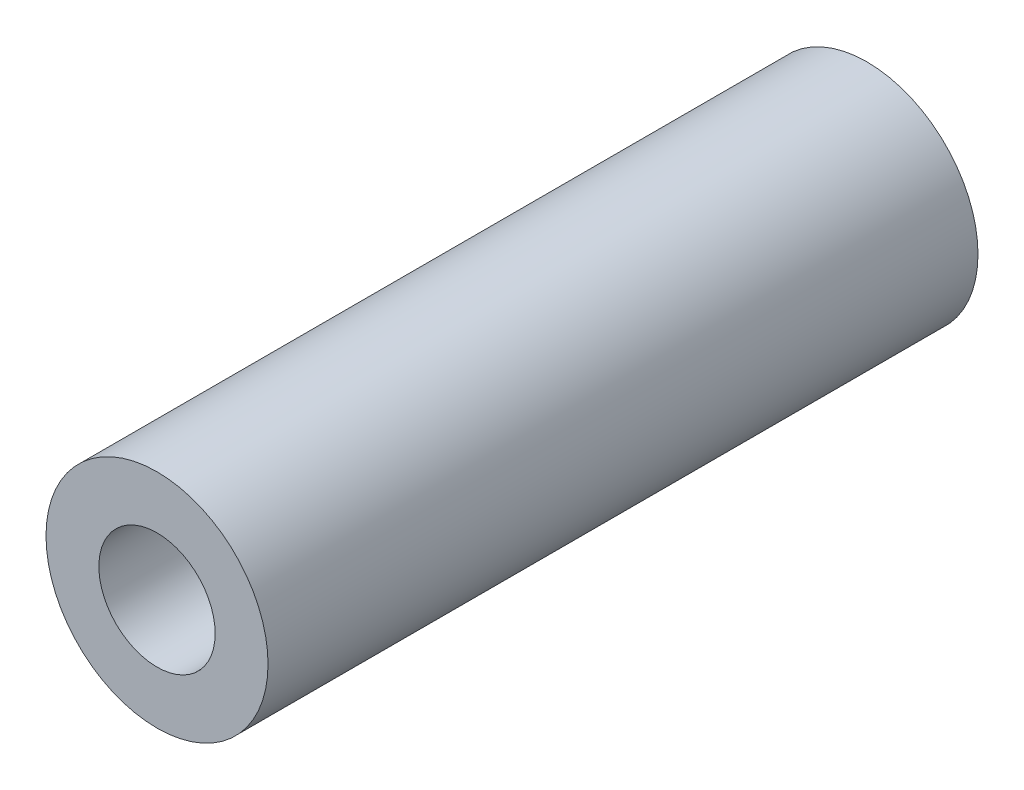
ISO-10303-21;
HEADER;
FILE_DESCRIPTION(('STEP AP214'),'2;1');
FILE_NAME('part.step','',(''),(''),'','','');
FILE_SCHEMA(('AUTOMOTIVE_DESIGN { 1 0 10303 214 1 1 1 1 }'));
ENDSEC;
DATA;
#1=APPLICATION_CONTEXT('core data for automotive mechanical design processes');
#2=APPLICATION_PROTOCOL_DEFINITION('international standard','automotive_design',2000,#1);
#3=PRODUCT_CONTEXT('',#1,'mechanical');
#4=PRODUCT('Part','Part','',(#3));
#5=PRODUCT_RELATED_PRODUCT_CATEGORY('part','',(#4));
#6=PRODUCT_DEFINITION_FORMATION('','',#4);
#7=PRODUCT_DEFINITION_CONTEXT('part definition',#1,'design');
#8=PRODUCT_DEFINITION('design','',#6,#7);
#9=PRODUCT_DEFINITION_SHAPE('','',#8);
#10=(LENGTH_UNIT() NAMED_UNIT(*) SI_UNIT(.MILLI.,.METRE.));
#11=(NAMED_UNIT(*) PLANE_ANGLE_UNIT() SI_UNIT($,.RADIAN.));
#12=(NAMED_UNIT(*) SI_UNIT($,.STERADIAN.) SOLID_ANGLE_UNIT());
#13=UNCERTAINTY_MEASURE_WITH_UNIT(LENGTH_MEASURE(1.E-05),#10,'distance_accuracy_value','');
#14=(GEOMETRIC_REPRESENTATION_CONTEXT(3) GLOBAL_UNCERTAINTY_ASSIGNED_CONTEXT((#13)) GLOBAL_UNIT_ASSIGNED_CONTEXT((#10,
#11,#12)) REPRESENTATION_CONTEXT('',''));
#15=CARTESIAN_POINT('',(0.,0.,0.));
#16=DIRECTION('',(0.,0.,1.));
#17=DIRECTION('',(1.,0.,0.));
#18=AXIS2_PLACEMENT_3D('',#15,#16,#17);
#19=CARTESIAN_POINT('',(0.,0.,13.43));
#20=DIRECTION('',(0.,0.,1.));
#21=DIRECTION('',(1.,0.,0.));
#22=AXIS2_PLACEMENT_3D('',#19,#20,#21);
#23=PLANE('',#22);
#24=CARTESIAN_POINT('',(0.,0.,13.43));
#25=DIRECTION('',(0.,0.,1.));
#26=DIRECTION('',(1.,0.,0.));
#27=AXIS2_PLACEMENT_3D('',#24,#25,#26);
#28=CIRCLE('',#27,2.1);
#29=CARTESIAN_POINT('',(2.1,0.,13.43));
#30=VERTEX_POINT('',#29);
#31=EDGE_CURVE('E10',#30,#30,#28,.T.);
#32=ORIENTED_EDGE('',*,*,#31,.T.);
#33=EDGE_LOOP('',(#32));
#34=FACE_BOUND('',#33,.T.);
#35=CARTESIAN_POINT('',(0.,0.,13.43));
#36=DIRECTION('',(0.,0.,1.));
#37=DIRECTION('',(1.,0.,0.));
#38=AXIS2_PLACEMENT_3D('',#35,#36,#37);
#39=CIRCLE('',#38,1.1);
#40=CARTESIAN_POINT('',(1.1,0.,13.43));
#41=VERTEX_POINT('',#40);
#42=EDGE_CURVE('E48',#41,#41,#39,.T.);
#43=ORIENTED_EDGE('',*,*,#42,.F.);
#44=EDGE_LOOP('',(#43));
#45=FACE_BOUND('',#44,.T.);
#46=ADVANCED_FACE('F37',(#34,#45),#23,.T.);
#47=CARTESIAN_POINT('',(0.,0.,0.));
#48=DIRECTION('',(0.,0.,1.));
#49=DIRECTION('',(1.,0.,0.));
#50=AXIS2_PLACEMENT_3D('',#47,#48,#49);
#51=PLANE('',#50);
#52=CARTESIAN_POINT('',(0.,0.,0.));
#53=DIRECTION('',(0.,0.,1.));
#54=DIRECTION('',(1.,0.,0.));
#55=AXIS2_PLACEMENT_3D('',#52,#53,#54);
#56=CIRCLE('',#55,2.1);
#57=CARTESIAN_POINT('',(2.1,0.,0.));
#58=VERTEX_POINT('',#57);
#59=EDGE_CURVE('E41',#58,#58,#56,.T.);
#60=ORIENTED_EDGE('',*,*,#59,.F.);
#61=EDGE_LOOP('',(#60));
#62=FACE_BOUND('',#61,.T.);
#63=CARTESIAN_POINT('',(0.,0.,0.));
#64=DIRECTION('',(0.,0.,1.));
#65=DIRECTION('',(1.,0.,0.));
#66=AXIS2_PLACEMENT_3D('',#63,#64,#65);
#67=CIRCLE('',#66,1.1);
#68=CARTESIAN_POINT('',(1.1,0.,0.));
#69=VERTEX_POINT('',#68);
#70=EDGE_CURVE('E50',#69,#69,#67,.T.);
#71=ORIENTED_EDGE('',*,*,#70,.T.);
#72=EDGE_LOOP('',(#71));
#73=FACE_BOUND('',#72,.T.);
#74=ADVANCED_FACE('F60',(#62,#73),#51,.F.);
#75=CARTESIAN_POINT('',(0.,0.,13.43));
#76=DIRECTION('',(0.,0.,-1.));
#77=DIRECTION('',(-1.,0.,0.));
#78=AXIS2_PLACEMENT_3D('',#75,#76,#77);
#79=CYLINDRICAL_SURFACE('',#78,2.1);
#80=ORIENTED_EDGE('',*,*,#31,.F.);
#81=EDGE_LOOP('',(#80));
#82=FACE_BOUND('',#81,.T.);
#83=ORIENTED_EDGE('',*,*,#59,.T.);
#84=EDGE_LOOP('',(#83));
#85=FACE_BOUND('',#84,.T.);
#86=ADVANCED_FACE('F39',(#82,#85),#79,.T.);
#87=CARTESIAN_POINT('',(0.,0.,13.43));
#88=DIRECTION('',(0.,0.,-1.));
#89=DIRECTION('',(-1.,0.,0.));
#90=AXIS2_PLACEMENT_3D('',#87,#88,#89);
#91=CYLINDRICAL_SURFACE('',#90,1.1);
#92=ORIENTED_EDGE('',*,*,#42,.T.);
#93=EDGE_LOOP('',(#92));
#94=FACE_BOUND('',#93,.T.);
#95=ORIENTED_EDGE('',*,*,#70,.F.);
#96=EDGE_LOOP('',(#95));
#97=FACE_BOUND('',#96,.T.);
#98=ADVANCED_FACE('F56',(#94,#97),#91,.F.);
#99=CLOSED_SHELL('',(#46,#74,#86,#98));
#100=MANIFOLD_SOLID_BREP('B2',#99);
#101=ADVANCED_BREP_SHAPE_REPRESENTATION('',(#18,#100),#14);
#102=SHAPE_DEFINITION_REPRESENTATION(#9,#101);
ENDSEC;
END-ISO-10303-21;
